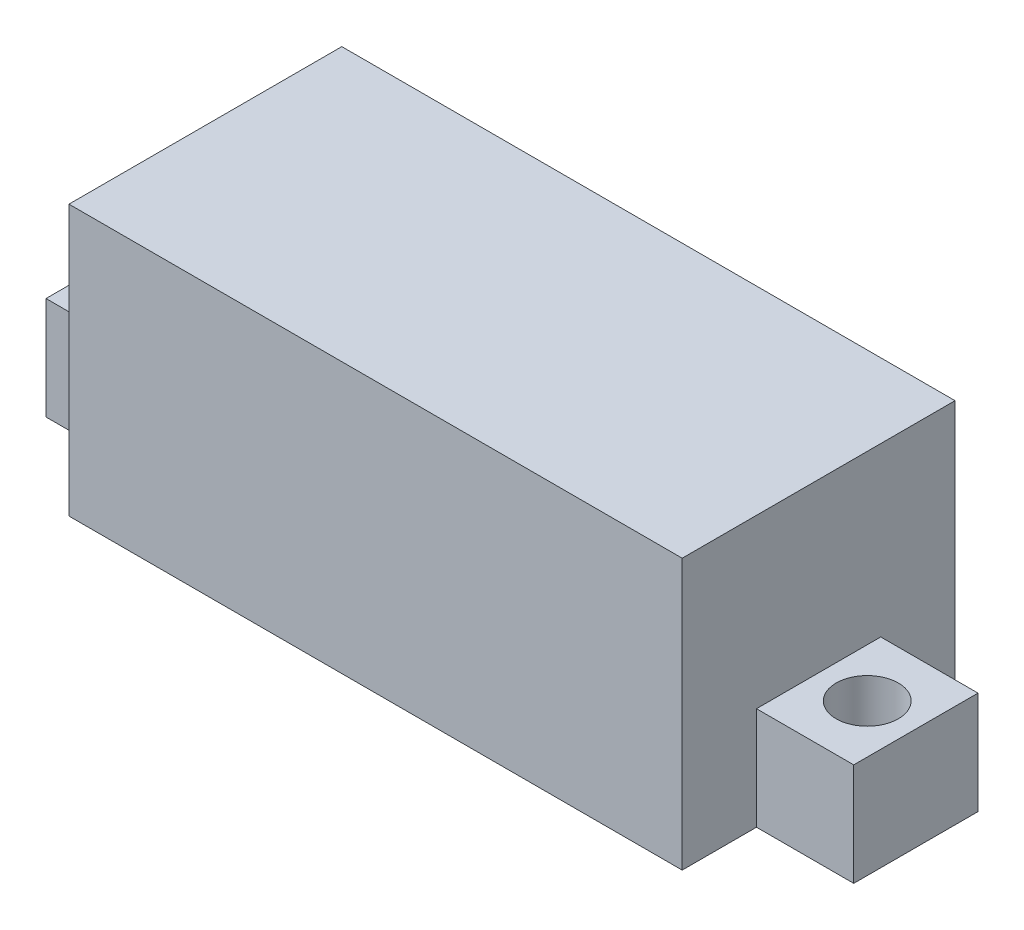
ISO-10303-21;
HEADER;
FILE_DESCRIPTION(('STEP AP214'),'2;1');
FILE_NAME('part.step','',(''),(''),'','','');
FILE_SCHEMA(('AUTOMOTIVE_DESIGN { 1 0 10303 214 1 1 1 1 }'));
ENDSEC;
DATA;
#1=APPLICATION_CONTEXT('core data for automotive mechanical design processes');
#2=APPLICATION_PROTOCOL_DEFINITION('international standard','automotive_design',2000,#1);
#3=PRODUCT_CONTEXT('',#1,'mechanical');
#4=PRODUCT('Part','Part','',(#3));
#5=PRODUCT_RELATED_PRODUCT_CATEGORY('part','',(#4));
#6=PRODUCT_DEFINITION_FORMATION('','',#4);
#7=PRODUCT_DEFINITION_CONTEXT('part definition',#1,'design');
#8=PRODUCT_DEFINITION('design','',#6,#7);
#9=PRODUCT_DEFINITION_SHAPE('','',#8);
#10=(LENGTH_UNIT() NAMED_UNIT(*) SI_UNIT(.MILLI.,.METRE.));
#11=(NAMED_UNIT(*) PLANE_ANGLE_UNIT() SI_UNIT($,.RADIAN.));
#12=(NAMED_UNIT(*) SI_UNIT($,.STERADIAN.) SOLID_ANGLE_UNIT());
#13=UNCERTAINTY_MEASURE_WITH_UNIT(LENGTH_MEASURE(1.E-05),#10,'distance_accuracy_value','');
#14=(GEOMETRIC_REPRESENTATION_CONTEXT(3) GLOBAL_UNCERTAINTY_ASSIGNED_CONTEXT((#13)) GLOBAL_UNIT_ASSIGNED_CONTEXT((#10,
#11,#12)) REPRESENTATION_CONTEXT('',''));
#15=CARTESIAN_POINT('',(0.,0.,0.));
#16=DIRECTION('',(0.,0.,1.));
#17=DIRECTION('',(1.,0.,0.));
#18=AXIS2_PLACEMENT_3D('',#15,#16,#17);
#19=CARTESIAN_POINT('',(22.7,10.,0.));
#20=DIRECTION('',(-1.,0.,0.));
#21=DIRECTION('',(0.,0.,1.));
#22=AXIS2_PLACEMENT_3D('',#19,#20,#21);
#23=PLANE('',#22);
#24=DIRECTION('',(0.,-1.,0.));
#25=VECTOR('',#24,1.);
#26=CARTESIAN_POINT('',(22.7,3.8,-2.75));
#27=LINE('',#26,#25);
#28=CARTESIAN_POINT('',(22.7,3.8,-2.75));
#29=VERTEX_POINT('',#28);
#30=CARTESIAN_POINT('',(22.7,0.,-2.75));
#31=VERTEX_POINT('',#30);
#32=EDGE_CURVE('E144',#29,#31,#27,.T.);
#33=ORIENTED_EDGE('',*,*,#32,.F.);
#34=DIRECTION('',(0.,0.,-1.));
#35=VECTOR('',#34,1.);
#36=CARTESIAN_POINT('',(22.7,3.8,-2.75));
#37=LINE('',#36,#35);
#38=CARTESIAN_POINT('',(22.7,3.8,-7.35));
#39=VERTEX_POINT('',#38);
#40=EDGE_CURVE('E129',#29,#39,#37,.T.);
#41=ORIENTED_EDGE('',*,*,#40,.T.);
#42=DIRECTION('',(0.,-1.,0.));
#43=VECTOR('',#42,1.);
#44=CARTESIAN_POINT('',(22.7,3.8,-7.35));
#45=LINE('',#44,#43);
#46=CARTESIAN_POINT('',(22.7,0.,-7.35));
#47=VERTEX_POINT('',#46);
#48=EDGE_CURVE('E155',#39,#47,#45,.T.);
#49=ORIENTED_EDGE('',*,*,#48,.T.);
#50=DIRECTION('',(0.,0.,-1.));
#51=VECTOR('',#50,1.);
#52=CARTESIAN_POINT('',(22.7,0.,0.));
#53=LINE('',#52,#51);
#54=CARTESIAN_POINT('',(22.7,0.,-10.1));
#55=VERTEX_POINT('',#54);
#56=EDGE_CURVE('E235',#47,#55,#53,.T.);
#57=ORIENTED_EDGE('',*,*,#56,.T.);
#58=DIRECTION('',(0.,-1.,0.));
#59=VECTOR('',#58,1.);
#60=CARTESIAN_POINT('',(22.7,10.,-10.1));
#61=LINE('',#60,#59);
#62=CARTESIAN_POINT('',(22.7,10.,-10.1));
#63=VERTEX_POINT('',#62);
#64=EDGE_CURVE('E243',#63,#55,#61,.T.);
#65=ORIENTED_EDGE('',*,*,#64,.F.);
#66=DIRECTION('',(0.,0.,-1.));
#67=VECTOR('',#66,1.);
#68=CARTESIAN_POINT('',(22.7,10.,0.));
#69=LINE('',#68,#67);
#70=CARTESIAN_POINT('',(22.7,10.,0.));
#71=VERTEX_POINT('',#70);
#72=EDGE_CURVE('E221',#71,#63,#69,.T.);
#73=ORIENTED_EDGE('',*,*,#72,.F.);
#74=DIRECTION('',(0.,-1.,0.));
#75=VECTOR('',#74,1.);
#76=CARTESIAN_POINT('',(22.7,10.,0.));
#77=LINE('',#76,#75);
#78=CARTESIAN_POINT('',(22.7,0.,0.));
#79=VERTEX_POINT('',#78);
#80=EDGE_CURVE('E47',#71,#79,#77,.T.);
#81=ORIENTED_EDGE('',*,*,#80,.T.);
#82=EDGE_CURVE('E153',#79,#31,#53,.T.);
#83=ORIENTED_EDGE('',*,*,#82,.T.);
#84=EDGE_LOOP('',(#33,#41,#49,#57,#65,#73,#81,#83));
#85=FACE_BOUND('',#84,.T.);
#86=ADVANCED_FACE('F38',(#85),#23,.F.);
#87=CARTESIAN_POINT('',(0.,10.,0.));
#88=DIRECTION('',(1.,0.,0.));
#89=DIRECTION('',(0.,0.,-1.));
#90=AXIS2_PLACEMENT_3D('',#87,#88,#89);
#91=PLANE('',#90);
#92=DIRECTION('',(0.,-1.,0.));
#93=VECTOR('',#92,1.);
#94=CARTESIAN_POINT('',(0.,3.8,-7.35));
#95=LINE('',#94,#93);
#96=CARTESIAN_POINT('',(0.,3.8,-7.35));
#97=VERTEX_POINT('',#96);
#98=CARTESIAN_POINT('',(0.,0.,-7.35));
#99=VERTEX_POINT('',#98);
#100=EDGE_CURVE('E202',#97,#99,#95,.T.);
#101=ORIENTED_EDGE('',*,*,#100,.F.);
#102=DIRECTION('',(0.,0.,1.));
#103=VECTOR('',#102,1.);
#104=CARTESIAN_POINT('',(0.,3.8,-2.75));
#105=LINE('',#104,#103);
#106=CARTESIAN_POINT('',(0.,3.8,-2.75));
#107=VERTEX_POINT('',#106);
#108=EDGE_CURVE('E175',#97,#107,#105,.T.);
#109=ORIENTED_EDGE('',*,*,#108,.T.);
#110=DIRECTION('',(0.,-1.,0.));
#111=VECTOR('',#110,1.);
#112=CARTESIAN_POINT('',(0.,3.8,-2.75));
#113=LINE('',#112,#111);
#114=CARTESIAN_POINT('',(0.,0.,-2.75));
#115=VERTEX_POINT('',#114);
#116=EDGE_CURVE('E192',#107,#115,#113,.T.);
#117=ORIENTED_EDGE('',*,*,#116,.T.);
#118=DIRECTION('',(0.,0.,1.));
#119=VECTOR('',#118,1.);
#120=CARTESIAN_POINT('',(0.,0.,0.));
#121=LINE('',#120,#119);
#122=CARTESIAN_POINT('',(0.,0.,0.));
#123=VERTEX_POINT('',#122);
#124=EDGE_CURVE('E205',#115,#123,#121,.T.);
#125=ORIENTED_EDGE('',*,*,#124,.T.);
#126=DIRECTION('',(0.,-1.,0.));
#127=VECTOR('',#126,1.);
#128=CARTESIAN_POINT('',(0.,10.,0.));
#129=LINE('',#128,#127);
#130=CARTESIAN_POINT('',(0.,10.,0.));
#131=VERTEX_POINT('',#130);
#132=EDGE_CURVE('E11',#131,#123,#129,.T.);
#133=ORIENTED_EDGE('',*,*,#132,.F.);
#134=DIRECTION('',(0.,0.,1.));
#135=VECTOR('',#134,1.);
#136=CARTESIAN_POINT('',(0.,10.,0.));
#137=LINE('',#136,#135);
#138=CARTESIAN_POINT('',(0.,10.,-10.1));
#139=VERTEX_POINT('',#138);
#140=EDGE_CURVE('E214',#139,#131,#137,.T.);
#141=ORIENTED_EDGE('',*,*,#140,.F.);
#142=DIRECTION('',(0.,-1.,0.));
#143=VECTOR('',#142,1.);
#144=CARTESIAN_POINT('',(0.,10.,-10.1));
#145=LINE('',#144,#143);
#146=CARTESIAN_POINT('',(0.,0.,-10.1));
#147=VERTEX_POINT('',#146);
#148=EDGE_CURVE('E227',#139,#147,#145,.T.);
#149=ORIENTED_EDGE('',*,*,#148,.T.);
#150=EDGE_CURVE('E228',#147,#99,#121,.T.);
#151=ORIENTED_EDGE('',*,*,#150,.T.);
#152=EDGE_LOOP('',(#101,#109,#117,#125,#133,#141,#149,#151));
#153=FACE_BOUND('',#152,.T.);
#154=ADVANCED_FACE('F40',(#153),#91,.F.);
#155=CARTESIAN_POINT('',(0.,10.,0.));
#156=DIRECTION('',(0.,0.,-1.));
#157=DIRECTION('',(-1.,0.,0.));
#158=AXIS2_PLACEMENT_3D('',#155,#156,#157);
#159=PLANE('',#158);
#160=DIRECTION('',(1.,0.,0.));
#161=VECTOR('',#160,1.);
#162=CARTESIAN_POINT('',(0.,0.,0.));
#163=LINE('',#162,#161);
#164=EDGE_CURVE('E232',#123,#79,#163,.T.);
#165=ORIENTED_EDGE('',*,*,#164,.T.);
#166=ORIENTED_EDGE('',*,*,#80,.F.);
#167=DIRECTION('',(1.,0.,0.));
#168=VECTOR('',#167,1.);
#169=CARTESIAN_POINT('',(0.,10.,0.));
#170=LINE('',#169,#168);
#171=EDGE_CURVE('E217',#131,#71,#170,.T.);
#172=ORIENTED_EDGE('',*,*,#171,.F.);
#173=ORIENTED_EDGE('',*,*,#132,.T.);
#174=EDGE_LOOP('',(#165,#166,#172,#173));
#175=FACE_BOUND('',#174,.T.);
#176=ADVANCED_FACE('F295',(#175),#159,.F.);
#177=CARTESIAN_POINT('',(0.,10.,-10.1));
#178=DIRECTION('',(0.,0.,1.));
#179=DIRECTION('',(1.,0.,0.));
#180=AXIS2_PLACEMENT_3D('',#177,#178,#179);
#181=PLANE('',#180);
#182=DIRECTION('',(-1.,0.,0.));
#183=VECTOR('',#182,1.);
#184=CARTESIAN_POINT('',(0.,0.,-10.1));
#185=LINE('',#184,#183);
#186=EDGE_CURVE('E218',#55,#147,#185,.T.);
#187=ORIENTED_EDGE('',*,*,#186,.T.);
#188=ORIENTED_EDGE('',*,*,#148,.F.);
#189=DIRECTION('',(-1.,0.,0.));
#190=VECTOR('',#189,1.);
#191=CARTESIAN_POINT('',(0.,10.,-10.1));
#192=LINE('',#191,#190);
#193=EDGE_CURVE('E224',#63,#139,#192,.T.);
#194=ORIENTED_EDGE('',*,*,#193,.F.);
#195=ORIENTED_EDGE('',*,*,#64,.T.);
#196=EDGE_LOOP('',(#187,#188,#194,#195));
#197=FACE_BOUND('',#196,.T.);
#198=ADVANCED_FACE('F298',(#197),#181,.F.);
#199=CARTESIAN_POINT('',(0.,10.,0.));
#200=DIRECTION('',(0.,-1.,0.));
#201=DIRECTION('',(0.,0.,-1.));
#202=AXIS2_PLACEMENT_3D('',#199,#200,#201);
#203=PLANE('',#202);
#204=ORIENTED_EDGE('',*,*,#140,.T.);
#205=ORIENTED_EDGE('',*,*,#171,.T.);
#206=ORIENTED_EDGE('',*,*,#72,.T.);
#207=ORIENTED_EDGE('',*,*,#193,.T.);
#208=EDGE_LOOP('',(#204,#205,#206,#207));
#209=FACE_BOUND('',#208,.T.);
#210=ADVANCED_FACE('F304',(#209),#203,.F.);
#211=CARTESIAN_POINT('',(0.,0.,0.));
#212=DIRECTION('',(0.,-1.,0.));
#213=DIRECTION('',(0.,0.,-1.));
#214=AXIS2_PLACEMENT_3D('',#211,#212,#213);
#215=PLANE('',#214);
#216=ORIENTED_EDGE('',*,*,#150,.F.);
#217=ORIENTED_EDGE('',*,*,#186,.F.);
#218=ORIENTED_EDGE('',*,*,#56,.F.);
#219=DIRECTION('',(1.,0.,0.));
#220=VECTOR('',#219,1.);
#221=CARTESIAN_POINT('',(22.7,0.,-7.35));
#222=LINE('',#221,#220);
#223=CARTESIAN_POINT('',(26.3,0.,-7.35));
#224=VERTEX_POINT('',#223);
#225=EDGE_CURVE('E54',#47,#224,#222,.T.);
#226=ORIENTED_EDGE('',*,*,#225,.T.);
#227=DIRECTION('',(0.,0.,1.));
#228=VECTOR('',#227,1.);
#229=CARTESIAN_POINT('',(26.3,0.,-2.75));
#230=LINE('',#229,#228);
#231=CARTESIAN_POINT('',(26.3,0.,-2.75));
#232=VERTEX_POINT('',#231);
#233=EDGE_CURVE('E148',#224,#232,#230,.T.);
#234=ORIENTED_EDGE('',*,*,#233,.T.);
#235=DIRECTION('',(-1.,0.,0.));
#236=VECTOR('',#235,1.);
#237=CARTESIAN_POINT('',(22.7,0.,-2.75));
#238=LINE('',#237,#236);
#239=EDGE_CURVE('E259',#232,#31,#238,.T.);
#240=ORIENTED_EDGE('',*,*,#239,.T.);
#241=ORIENTED_EDGE('',*,*,#82,.F.);
#242=ORIENTED_EDGE('',*,*,#164,.F.);
#243=ORIENTED_EDGE('',*,*,#124,.F.);
#244=DIRECTION('',(-1.,0.,0.));
#245=VECTOR('',#244,1.);
#246=CARTESIAN_POINT('',(0.,0.,-2.75));
#247=LINE('',#246,#245);
#248=CARTESIAN_POINT('',(-3.6,0.,-2.75));
#249=VERTEX_POINT('',#248);
#250=EDGE_CURVE('E62',#115,#249,#247,.T.);
#251=ORIENTED_EDGE('',*,*,#250,.T.);
#252=DIRECTION('',(0.,0.,-1.));
#253=VECTOR('',#252,1.);
#254=CARTESIAN_POINT('',(-3.6,0.,-2.75));
#255=LINE('',#254,#253);
#256=CARTESIAN_POINT('',(-3.6,0.,-7.35));
#257=VERTEX_POINT('',#256);
#258=EDGE_CURVE('E195',#249,#257,#255,.T.);
#259=ORIENTED_EDGE('',*,*,#258,.T.);
#260=DIRECTION('',(1.,0.,0.));
#261=VECTOR('',#260,1.);
#262=CARTESIAN_POINT('',(0.,0.,-7.35));
#263=LINE('',#262,#261);
#264=EDGE_CURVE('E180',#257,#99,#263,.T.);
#265=ORIENTED_EDGE('',*,*,#264,.T.);
#266=EDGE_LOOP('',(#216,#217,#218,#226,#234,#240,#241,#242,#243,#251,#259,#265));
#267=FACE_BOUND('',#266,.T.);
#268=CARTESIAN_POINT('',(-1.8,0.,-5.05));
#269=DIRECTION('',(0.,-1.,0.));
#270=DIRECTION('',(0.,0.,-1.));
#271=AXIS2_PLACEMENT_3D('',#268,#269,#270);
#272=CIRCLE('',#271,1.15);
#273=CARTESIAN_POINT('',(-1.8,0.,-6.2));
#274=VERTEX_POINT('',#273);
#275=EDGE_CURVE('E171',#274,#274,#272,.T.);
#276=ORIENTED_EDGE('',*,*,#275,.F.);
#277=EDGE_LOOP('',(#276));
#278=FACE_BOUND('',#277,.T.);
#279=CARTESIAN_POINT('',(24.5,0.,-5.05));
#280=DIRECTION('',(0.,-1.,0.));
#281=DIRECTION('',(0.,0.,1.));
#282=AXIS2_PLACEMENT_3D('',#279,#280,#281);
#283=CIRCLE('',#282,1.15);
#284=CARTESIAN_POINT('',(24.5,0.,-6.2));
#285=VERTEX_POINT('',#284);
#286=EDGE_CURVE('E268',#285,#285,#283,.T.);
#287=ORIENTED_EDGE('',*,*,#286,.F.);
#288=EDGE_LOOP('',(#287));
#289=FACE_BOUND('',#288,.T.);
#290=ADVANCED_FACE('F255',(#267,#278,#289),#215,.T.);
#291=CARTESIAN_POINT('',(0.,3.8,-7.35));
#292=DIRECTION('',(0.,0.,-1.));
#293=DIRECTION('',(-1.,0.,0.));
#294=AXIS2_PLACEMENT_3D('',#291,#292,#293);
#295=PLANE('',#294);
#296=ORIENTED_EDGE('',*,*,#264,.F.);
#297=DIRECTION('',(0.,-1.,0.));
#298=VECTOR('',#297,1.);
#299=CARTESIAN_POINT('',(-3.6,3.8,-7.35));
#300=LINE('',#299,#298);
#301=CARTESIAN_POINT('',(-3.6,3.8,-7.35));
#302=VERTEX_POINT('',#301);
#303=EDGE_CURVE('E206',#302,#257,#300,.T.);
#304=ORIENTED_EDGE('',*,*,#303,.F.);
#305=DIRECTION('',(1.,0.,0.));
#306=VECTOR('',#305,1.);
#307=CARTESIAN_POINT('',(0.,3.8,-7.35));
#308=LINE('',#307,#306);
#309=EDGE_CURVE('E188',#302,#97,#308,.T.);
#310=ORIENTED_EDGE('',*,*,#309,.T.);
#311=ORIENTED_EDGE('',*,*,#100,.T.);
#312=EDGE_LOOP('',(#296,#304,#310,#311));
#313=FACE_BOUND('',#312,.T.);
#314=ADVANCED_FACE('F319',(#313),#295,.T.);
#315=CARTESIAN_POINT('',(-3.6,3.8,-2.75));
#316=DIRECTION('',(-1.,0.,0.));
#317=DIRECTION('',(0.,0.,1.));
#318=AXIS2_PLACEMENT_3D('',#315,#316,#317);
#319=PLANE('',#318);
#320=ORIENTED_EDGE('',*,*,#258,.F.);
#321=DIRECTION('',(0.,-1.,0.));
#322=VECTOR('',#321,1.);
#323=CARTESIAN_POINT('',(-3.6,3.8,-2.75));
#324=LINE('',#323,#322);
#325=CARTESIAN_POINT('',(-3.6,3.8,-2.75));
#326=VERTEX_POINT('',#325);
#327=EDGE_CURVE('E209',#326,#249,#324,.T.);
#328=ORIENTED_EDGE('',*,*,#327,.F.);
#329=DIRECTION('',(0.,0.,-1.));
#330=VECTOR('',#329,1.);
#331=CARTESIAN_POINT('',(-3.6,3.8,-2.75));
#332=LINE('',#331,#330);
#333=EDGE_CURVE('E184',#326,#302,#332,.T.);
#334=ORIENTED_EDGE('',*,*,#333,.T.);
#335=ORIENTED_EDGE('',*,*,#303,.T.);
#336=EDGE_LOOP('',(#320,#328,#334,#335));
#337=FACE_BOUND('',#336,.T.);
#338=ADVANCED_FACE('F324',(#337),#319,.T.);
#339=CARTESIAN_POINT('',(0.,3.8,-2.75));
#340=DIRECTION('',(0.,0.,1.));
#341=DIRECTION('',(1.,0.,0.));
#342=AXIS2_PLACEMENT_3D('',#339,#340,#341);
#343=PLANE('',#342);
#344=ORIENTED_EDGE('',*,*,#250,.F.);
#345=ORIENTED_EDGE('',*,*,#116,.F.);
#346=DIRECTION('',(-1.,0.,0.));
#347=VECTOR('',#346,1.);
#348=CARTESIAN_POINT('',(0.,3.8,-2.75));
#349=LINE('',#348,#347);
#350=EDGE_CURVE('E179',#107,#326,#349,.T.);
#351=ORIENTED_EDGE('',*,*,#350,.T.);
#352=ORIENTED_EDGE('',*,*,#327,.T.);
#353=EDGE_LOOP('',(#344,#345,#351,#352));
#354=FACE_BOUND('',#353,.T.);
#355=ADVANCED_FACE('F330',(#354),#343,.T.);
#356=CARTESIAN_POINT('',(0.,3.8,0.));
#357=DIRECTION('',(0.,1.,0.));
#358=DIRECTION('',(0.,0.,1.));
#359=AXIS2_PLACEMENT_3D('',#356,#357,#358);
#360=PLANE('',#359);
#361=CARTESIAN_POINT('',(-1.8,3.8,-5.05));
#362=DIRECTION('',(0.,-1.,0.));
#363=DIRECTION('',(0.,0.,-1.));
#364=AXIS2_PLACEMENT_3D('',#361,#362,#363);
#365=CIRCLE('',#364,1.15);
#366=CARTESIAN_POINT('',(-1.8,3.8,-6.2));
#367=VERTEX_POINT('',#366);
#368=EDGE_CURVE('E167',#367,#367,#365,.T.);
#369=ORIENTED_EDGE('',*,*,#368,.T.);
#370=EDGE_LOOP('',(#369));
#371=FACE_BOUND('',#370,.T.);
#372=ORIENTED_EDGE('',*,*,#108,.F.);
#373=ORIENTED_EDGE('',*,*,#309,.F.);
#374=ORIENTED_EDGE('',*,*,#333,.F.);
#375=ORIENTED_EDGE('',*,*,#350,.F.);
#376=EDGE_LOOP('',(#372,#373,#374,#375));
#377=FACE_BOUND('',#376,.T.);
#378=ADVANCED_FACE('F333',(#371,#377),#360,.T.);
#379=CARTESIAN_POINT('',(-1.8,3.8,-5.05));
#380=DIRECTION('',(0.,-1.,0.));
#381=DIRECTION('',(0.,0.,-1.));
#382=AXIS2_PLACEMENT_3D('',#379,#380,#381);
#383=CYLINDRICAL_SURFACE('',#382,1.15);
#384=CARTESIAN_POINT('',(-1.8,3.8,-6.2));
#385=CARTESIAN_POINT('',(-1.8,3.76041666666667,-6.2));
#386=CARTESIAN_POINT('',(-1.8,3.72083333333333,-6.2));
#387=CARTESIAN_POINT('',(-1.8,3.64166666666667,-6.2));
#388=CARTESIAN_POINT('',(-1.8,3.60208333333333,-6.2));
#389=CARTESIAN_POINT('',(-1.8,3.52291666666667,-6.2));
#390=CARTESIAN_POINT('',(-1.8,3.48333333333333,-6.2));
#391=CARTESIAN_POINT('',(-1.8,3.40416666666667,-6.2));
#392=CARTESIAN_POINT('',(-1.8,3.36458333333333,-6.2));
#393=CARTESIAN_POINT('',(-1.8,3.28541666666667,-6.2));
#394=CARTESIAN_POINT('',(-1.8,3.24583333333333,-6.2));
#395=CARTESIAN_POINT('',(-1.8,3.16666666666667,-6.2));
#396=CARTESIAN_POINT('',(-1.8,3.12708333333333,-6.2));
#397=CARTESIAN_POINT('',(-1.8,3.04791666666667,-6.2));
#398=CARTESIAN_POINT('',(-1.8,3.00833333333333,-6.2));
#399=CARTESIAN_POINT('',(-1.8,2.92916666666667,-6.2));
#400=CARTESIAN_POINT('',(-1.8,2.88958333333333,-6.2));
#401=CARTESIAN_POINT('',(-1.8,2.81041666666667,-6.2));
#402=CARTESIAN_POINT('',(-1.8,2.77083333333333,-6.2));
#403=CARTESIAN_POINT('',(-1.8,2.69166666666667,-6.2));
#404=CARTESIAN_POINT('',(-1.8,2.65208333333333,-6.2));
#405=CARTESIAN_POINT('',(-1.8,2.57291666666667,-6.2));
#406=CARTESIAN_POINT('',(-1.8,2.53333333333333,-6.2));
#407=CARTESIAN_POINT('',(-1.8,2.45416666666667,-6.2));
#408=CARTESIAN_POINT('',(-1.8,2.41458333333333,-6.2));
#409=CARTESIAN_POINT('',(-1.8,2.33541666666667,-6.2));
#410=CARTESIAN_POINT('',(-1.8,2.29583333333333,-6.2));
#411=CARTESIAN_POINT('',(-1.8,2.21666666666667,-6.2));
#412=CARTESIAN_POINT('',(-1.8,2.17708333333333,-6.2));
#413=CARTESIAN_POINT('',(-1.8,2.09791666666667,-6.2));
#414=CARTESIAN_POINT('',(-1.8,2.05833333333333,-6.2));
#415=CARTESIAN_POINT('',(-1.8,1.97916666666667,-6.2));
#416=CARTESIAN_POINT('',(-1.8,1.93958333333333,-6.2));
#417=CARTESIAN_POINT('',(-1.8,1.86041666666667,-6.2));
#418=CARTESIAN_POINT('',(-1.8,1.82083333333333,-6.2));
#419=CARTESIAN_POINT('',(-1.8,1.74166666666667,-6.2));
#420=CARTESIAN_POINT('',(-1.8,1.70208333333333,-6.2));
#421=CARTESIAN_POINT('',(-1.8,1.62291666666667,-6.2));
#422=CARTESIAN_POINT('',(-1.8,1.58333333333333,-6.2));
#423=CARTESIAN_POINT('',(-1.8,1.50416666666667,-6.2));
#424=CARTESIAN_POINT('',(-1.8,1.46458333333333,-6.2));
#425=CARTESIAN_POINT('',(-1.8,1.38541666666667,-6.2));
#426=CARTESIAN_POINT('',(-1.8,1.34583333333333,-6.2));
#427=CARTESIAN_POINT('',(-1.8,1.26666666666667,-6.2));
#428=CARTESIAN_POINT('',(-1.8,1.22708333333333,-6.2));
#429=CARTESIAN_POINT('',(-1.8,1.14791666666667,-6.2));
#430=CARTESIAN_POINT('',(-1.8,1.10833333333333,-6.2));
#431=CARTESIAN_POINT('',(-1.8,1.02916666666667,-6.2));
#432=CARTESIAN_POINT('',(-1.8,0.989583333333334,-6.2));
#433=CARTESIAN_POINT('',(-1.8,0.910416666666667,-6.2));
#434=CARTESIAN_POINT('',(-1.8,0.870833333333334,-6.2));
#435=CARTESIAN_POINT('',(-1.8,0.791666666666667,-6.2));
#436=CARTESIAN_POINT('',(-1.8,0.752083333333333,-6.2));
#437=CARTESIAN_POINT('',(-1.8,0.672916666666667,-6.2));
#438=CARTESIAN_POINT('',(-1.8,0.633333333333333,-6.2));
#439=CARTESIAN_POINT('',(-1.8,0.554166666666667,-6.2));
#440=CARTESIAN_POINT('',(-1.8,0.514583333333334,-6.2));
#441=CARTESIAN_POINT('',(-1.8,0.435416666666667,-6.2));
#442=CARTESIAN_POINT('',(-1.8,0.395833333333334,-6.2));
#443=CARTESIAN_POINT('',(-1.8,0.316666666666667,-6.2));
#444=CARTESIAN_POINT('',(-1.8,0.277083333333333,-6.2));
#445=CARTESIAN_POINT('',(-1.8,0.197916666666667,-6.2));
#446=CARTESIAN_POINT('',(-1.8,0.158333333333333,-6.2));
#447=CARTESIAN_POINT('',(-1.8,0.0791666666666666,-6.2));
#448=CARTESIAN_POINT('',(-1.8,0.0395833333333333,-6.2));
#449=CARTESIAN_POINT('',(-1.8,0.,-6.2));
#450=B_SPLINE_CURVE_WITH_KNOTS('',3,(#384,#385,#386,#387,#388,#389,#390,#391,#392,#393,#394,
#395,#396,#397,#398,#399,#400,#401,#402,#403,#404,#405,#406,#407,#408,#409,#410,#411,#412,#413,
#414,#415,#416,#417,#418,#419,#420,#421,#422,#423,#424,#425,#426,#427,#428,#429,#430,#431,#432,
#433,#434,#435,#436,#437,#438,#439,#440,#441,#442,#443,#444,#445,#446,#447,#448,#449),
.UNSPECIFIED.,.F.,.F.,(4,2,2,2,2,2,2,2,2,2,2,2,2,2,2,2,2,2,2,2,2,2,2,2,2,2,2,2,2,2,2,2,4),(0.,
0.11875,0.2375,0.35625,0.475,0.59375,0.7125,0.83125,0.95,1.06875,1.1875,1.30625,1.425,1.54375,
1.6625,1.78125,1.9,2.01875,2.1375,2.25625,2.375,2.49375,2.6125,2.73125,2.85,2.96875,3.0875,
3.20625,3.325,3.44375,3.5625,3.68125,3.8),.UNSPECIFIED.);
#451=EDGE_CURVE('BSEAM287',#367,#274,#450,.T.);
#452=ORIENTED_EDGE('',*,*,#368,.F.);
#453=ORIENTED_EDGE('',*,*,#275,.T.);
#454=ORIENTED_EDGE('',*,*,#451,.T.);
#455=ORIENTED_EDGE('',*,*,#451,.F.);
#456=EDGE_LOOP('',(#452,#454,#453,#455));
#457=FACE_BOUND('',#456,.T.);
#458=ADVANCED_FACE('F287',(#457),#383,.F.);
#459=CARTESIAN_POINT('',(22.7,3.8,-2.75));
#460=DIRECTION('',(0.,0.,1.));
#461=DIRECTION('',(1.,0.,0.));
#462=AXIS2_PLACEMENT_3D('',#459,#460,#461);
#463=PLANE('',#462);
#464=ORIENTED_EDGE('',*,*,#239,.F.);
#465=DIRECTION('',(0.,-1.,0.));
#466=VECTOR('',#465,1.);
#467=CARTESIAN_POINT('',(26.3,3.8,-2.75));
#468=LINE('',#467,#466);
#469=CARTESIAN_POINT('',(26.3,3.8,-2.75));
#470=VERTEX_POINT('',#469);
#471=EDGE_CURVE('E146',#470,#232,#468,.T.);
#472=ORIENTED_EDGE('',*,*,#471,.F.);
#473=DIRECTION('',(-1.,0.,0.));
#474=VECTOR('',#473,1.);
#475=CARTESIAN_POINT('',(22.7,3.8,-2.75));
#476=LINE('',#475,#474);
#477=EDGE_CURVE('E133',#470,#29,#476,.T.);
#478=ORIENTED_EDGE('',*,*,#477,.T.);
#479=ORIENTED_EDGE('',*,*,#32,.T.);
#480=EDGE_LOOP('',(#464,#472,#478,#479));
#481=FACE_BOUND('',#480,.T.);
#482=ADVANCED_FACE('F143',(#481),#463,.T.);
#483=CARTESIAN_POINT('',(26.3,3.8,-2.75));
#484=DIRECTION('',(1.,0.,0.));
#485=DIRECTION('',(0.,0.,-1.));
#486=AXIS2_PLACEMENT_3D('',#483,#484,#485);
#487=PLANE('',#486);
#488=ORIENTED_EDGE('',*,*,#233,.F.);
#489=DIRECTION('',(0.,-1.,0.));
#490=VECTOR('',#489,1.);
#491=CARTESIAN_POINT('',(26.3,3.8,-7.35));
#492=LINE('',#491,#490);
#493=CARTESIAN_POINT('',(26.3,3.8,-7.35));
#494=VERTEX_POINT('',#493);
#495=EDGE_CURVE('E161',#494,#224,#492,.T.);
#496=ORIENTED_EDGE('',*,*,#495,.F.);
#497=DIRECTION('',(0.,0.,1.));
#498=VECTOR('',#497,1.);
#499=CARTESIAN_POINT('',(26.3,3.8,-2.75));
#500=LINE('',#499,#498);
#501=EDGE_CURVE('E156',#494,#470,#500,.T.);
#502=ORIENTED_EDGE('',*,*,#501,.T.);
#503=ORIENTED_EDGE('',*,*,#471,.T.);
#504=EDGE_LOOP('',(#488,#496,#502,#503));
#505=FACE_BOUND('',#504,.T.);
#506=ADVANCED_FACE('F279',(#505),#487,.T.);
#507=CARTESIAN_POINT('',(22.7,3.8,-7.35));
#508=DIRECTION('',(0.,0.,-1.));
#509=DIRECTION('',(-1.,0.,0.));
#510=AXIS2_PLACEMENT_3D('',#507,#508,#509);
#511=PLANE('',#510);
#512=ORIENTED_EDGE('',*,*,#225,.F.);
#513=ORIENTED_EDGE('',*,*,#48,.F.);
#514=DIRECTION('',(1.,0.,0.));
#515=VECTOR('',#514,1.);
#516=CARTESIAN_POINT('',(22.7,3.8,-7.35));
#517=LINE('',#516,#515);
#518=EDGE_CURVE('E136',#39,#494,#517,.T.);
#519=ORIENTED_EDGE('',*,*,#518,.T.);
#520=ORIENTED_EDGE('',*,*,#495,.T.);
#521=EDGE_LOOP('',(#512,#513,#519,#520));
#522=FACE_BOUND('',#521,.T.);
#523=ADVANCED_FACE('F275',(#522),#511,.T.);
#524=CARTESIAN_POINT('',(0.,3.8,0.));
#525=DIRECTION('',(0.,1.,0.));
#526=DIRECTION('',(0.,0.,1.));
#527=AXIS2_PLACEMENT_3D('',#524,#525,#526);
#528=PLANE('',#527);
#529=CARTESIAN_POINT('',(24.5,3.8,-5.05));
#530=DIRECTION('',(0.,-1.,0.));
#531=DIRECTION('',(0.,0.,1.));
#532=AXIS2_PLACEMENT_3D('',#529,#530,#531);
#533=CIRCLE('',#532,1.15);
#534=CARTESIAN_POINT('',(24.5,3.8,-6.2));
#535=VERTEX_POINT('',#534);
#536=EDGE_CURVE('E262',#535,#535,#533,.T.);
#537=ORIENTED_EDGE('',*,*,#536,.T.);
#538=EDGE_LOOP('',(#537));
#539=FACE_BOUND('',#538,.T.);
#540=ORIENTED_EDGE('',*,*,#477,.F.);
#541=ORIENTED_EDGE('',*,*,#501,.F.);
#542=ORIENTED_EDGE('',*,*,#518,.F.);
#543=ORIENTED_EDGE('',*,*,#40,.F.);
#544=EDGE_LOOP('',(#540,#541,#542,#543));
#545=FACE_BOUND('',#544,.T.);
#546=ADVANCED_FACE('F131',(#539,#545),#528,.T.);
#547=CARTESIAN_POINT('',(24.5,3.8,-5.05));
#548=DIRECTION('',(0.,-1.,0.));
#549=DIRECTION('',(0.,0.,-1.));
#550=AXIS2_PLACEMENT_3D('',#547,#548,#549);
#551=CYLINDRICAL_SURFACE('',#550,1.15);
#552=CARTESIAN_POINT('',(24.5,3.8,-6.2));
#553=CARTESIAN_POINT('',(24.5,3.76041666666667,-6.2));
#554=CARTESIAN_POINT('',(24.5,3.72083333333333,-6.2));
#555=CARTESIAN_POINT('',(24.5,3.64166666666667,-6.2));
#556=CARTESIAN_POINT('',(24.5,3.60208333333333,-6.2));
#557=CARTESIAN_POINT('',(24.5,3.52291666666667,-6.2));
#558=CARTESIAN_POINT('',(24.5,3.48333333333333,-6.2));
#559=CARTESIAN_POINT('',(24.5,3.40416666666667,-6.2));
#560=CARTESIAN_POINT('',(24.5,3.36458333333333,-6.2));
#561=CARTESIAN_POINT('',(24.5,3.28541666666667,-6.2));
#562=CARTESIAN_POINT('',(24.5,3.24583333333333,-6.2));
#563=CARTESIAN_POINT('',(24.5,3.16666666666667,-6.2));
#564=CARTESIAN_POINT('',(24.5,3.12708333333333,-6.2));
#565=CARTESIAN_POINT('',(24.5,3.04791666666667,-6.2));
#566=CARTESIAN_POINT('',(24.5,3.00833333333333,-6.2));
#567=CARTESIAN_POINT('',(24.5,2.92916666666667,-6.2));
#568=CARTESIAN_POINT('',(24.5,2.88958333333333,-6.2));
#569=CARTESIAN_POINT('',(24.5,2.81041666666667,-6.2));
#570=CARTESIAN_POINT('',(24.5,2.77083333333333,-6.2));
#571=CARTESIAN_POINT('',(24.5,2.69166666666667,-6.2));
#572=CARTESIAN_POINT('',(24.5,2.65208333333333,-6.2));
#573=CARTESIAN_POINT('',(24.5,2.57291666666667,-6.2));
#574=CARTESIAN_POINT('',(24.5,2.53333333333333,-6.2));
#575=CARTESIAN_POINT('',(24.5,2.45416666666667,-6.2));
#576=CARTESIAN_POINT('',(24.5,2.41458333333333,-6.2));
#577=CARTESIAN_POINT('',(24.5,2.33541666666667,-6.2));
#578=CARTESIAN_POINT('',(24.5,2.29583333333333,-6.2));
#579=CARTESIAN_POINT('',(24.5,2.21666666666667,-6.2));
#580=CARTESIAN_POINT('',(24.5,2.17708333333333,-6.2));
#581=CARTESIAN_POINT('',(24.5,2.09791666666667,-6.2));
#582=CARTESIAN_POINT('',(24.5,2.05833333333333,-6.2));
#583=CARTESIAN_POINT('',(24.5,1.97916666666667,-6.2));
#584=CARTESIAN_POINT('',(24.5,1.93958333333333,-6.2));
#585=CARTESIAN_POINT('',(24.5,1.86041666666667,-6.2));
#586=CARTESIAN_POINT('',(24.5,1.82083333333333,-6.2));
#587=CARTESIAN_POINT('',(24.5,1.74166666666667,-6.2));
#588=CARTESIAN_POINT('',(24.5,1.70208333333333,-6.2));
#589=CARTESIAN_POINT('',(24.5,1.62291666666667,-6.2));
#590=CARTESIAN_POINT('',(24.5,1.58333333333333,-6.2));
#591=CARTESIAN_POINT('',(24.5,1.50416666666667,-6.2));
#592=CARTESIAN_POINT('',(24.5,1.46458333333333,-6.2));
#593=CARTESIAN_POINT('',(24.5,1.38541666666667,-6.2));
#594=CARTESIAN_POINT('',(24.5,1.34583333333333,-6.2));
#595=CARTESIAN_POINT('',(24.5,1.26666666666667,-6.2));
#596=CARTESIAN_POINT('',(24.5,1.22708333333333,-6.2));
#597=CARTESIAN_POINT('',(24.5,1.14791666666667,-6.2));
#598=CARTESIAN_POINT('',(24.5,1.10833333333333,-6.2));
#599=CARTESIAN_POINT('',(24.5,1.02916666666667,-6.2));
#600=CARTESIAN_POINT('',(24.5,0.989583333333334,-6.2));
#601=CARTESIAN_POINT('',(24.5,0.910416666666667,-6.2));
#602=CARTESIAN_POINT('',(24.5,0.870833333333334,-6.2));
#603=CARTESIAN_POINT('',(24.5,0.791666666666667,-6.2));
#604=CARTESIAN_POINT('',(24.5,0.752083333333333,-6.2));
#605=CARTESIAN_POINT('',(24.5,0.672916666666667,-6.2));
#606=CARTESIAN_POINT('',(24.5,0.633333333333333,-6.2));
#607=CARTESIAN_POINT('',(24.5,0.554166666666667,-6.2));
#608=CARTESIAN_POINT('',(24.5,0.514583333333334,-6.2));
#609=CARTESIAN_POINT('',(24.5,0.435416666666667,-6.2));
#610=CARTESIAN_POINT('',(24.5,0.395833333333334,-6.2));
#611=CARTESIAN_POINT('',(24.5,0.316666666666667,-6.2));
#612=CARTESIAN_POINT('',(24.5,0.277083333333333,-6.2));
#613=CARTESIAN_POINT('',(24.5,0.197916666666667,-6.2));
#614=CARTESIAN_POINT('',(24.5,0.158333333333333,-6.2));
#615=CARTESIAN_POINT('',(24.5,0.0791666666666666,-6.2));
#616=CARTESIAN_POINT('',(24.5,0.0395833333333333,-6.2));
#617=CARTESIAN_POINT('',(24.5,0.,-6.2));
#618=B_SPLINE_CURVE_WITH_KNOTS('',3,(#552,#553,#554,#555,#556,#557,#558,#559,#560,#561,#562,
#563,#564,#565,#566,#567,#568,#569,#570,#571,#572,#573,#574,#575,#576,#577,#578,#579,#580,#581,
#582,#583,#584,#585,#586,#587,#588,#589,#590,#591,#592,#593,#594,#595,#596,#597,#598,#599,#600,
#601,#602,#603,#604,#605,#606,#607,#608,#609,#610,#611,#612,#613,#614,#615,#616,#617),
.UNSPECIFIED.,.F.,.F.,(4,2,2,2,2,2,2,2,2,2,2,2,2,2,2,2,2,2,2,2,2,2,2,2,2,2,2,2,2,2,2,2,4),(0.,
0.11875,0.2375,0.35625,0.475,0.59375,0.7125,0.83125,0.95,1.06875,1.1875,1.30625,1.425,1.54375,
1.6625,1.78125,1.9,2.01875,2.1375,2.25625,2.375,2.49375,2.6125,2.73125,2.85,2.96875,3.0875,
3.20625,3.325,3.44375,3.5625,3.68125,3.8),.UNSPECIFIED.);
#619=EDGE_CURVE('BSEAM316',#535,#285,#618,.T.);
#620=ORIENTED_EDGE('',*,*,#536,.F.);
#621=ORIENTED_EDGE('',*,*,#286,.T.);
#622=ORIENTED_EDGE('',*,*,#619,.T.);
#623=ORIENTED_EDGE('',*,*,#619,.F.);
#624=EDGE_LOOP('',(#620,#622,#621,#623));
#625=FACE_BOUND('',#624,.T.);
#626=ADVANCED_FACE('F316',(#625),#551,.F.);
#627=CLOSED_SHELL('',(#86,#154,#176,#198,#210,#290,#314,#338,#355,#378,#458,#482,#506,#523,#546,#626));
#628=MANIFOLD_SOLID_BREP('B2',#627);
#629=ADVANCED_BREP_SHAPE_REPRESENTATION('',(#18,#628),#14);
#630=SHAPE_DEFINITION_REPRESENTATION(#9,#629);
ENDSEC;
END-ISO-10303-21;
